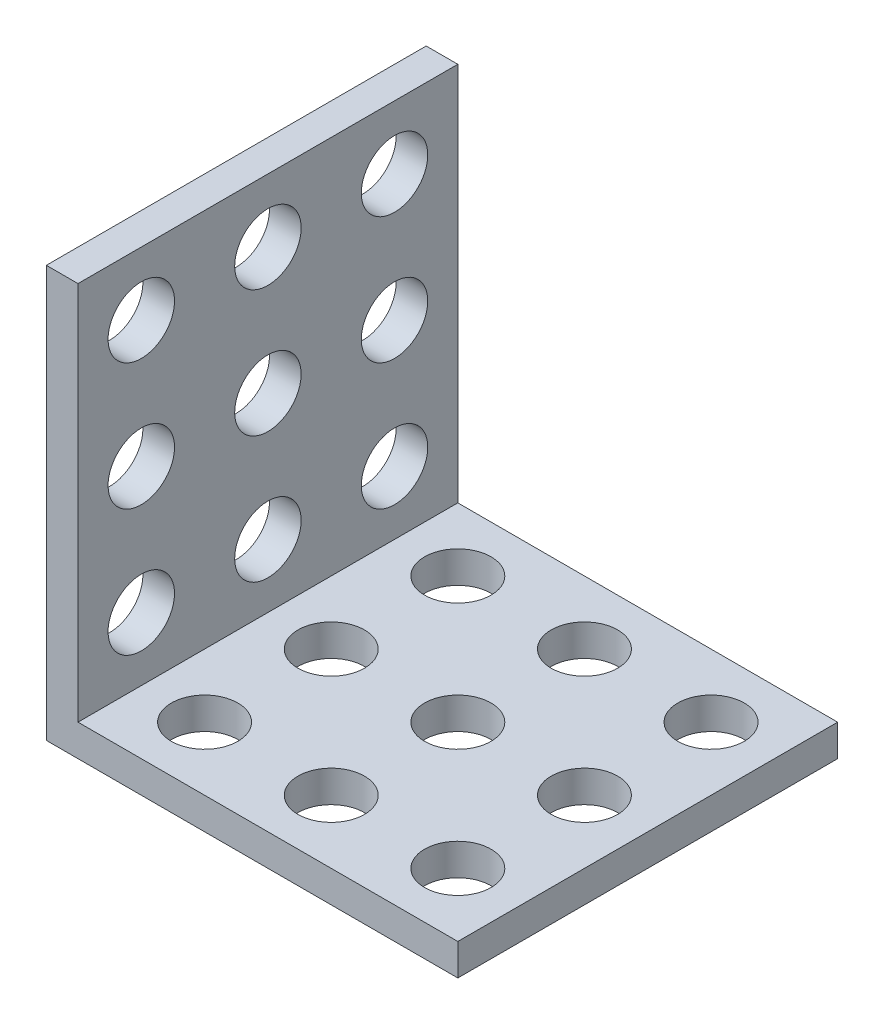
ISO-10303-21;
HEADER;
FILE_DESCRIPTION(('STEP AP214'),'2;1');
FILE_NAME('part.step','',(''),(''),'','','');
FILE_SCHEMA(('AUTOMOTIVE_DESIGN { 1 0 10303 214 1 1 1 1 }'));
ENDSEC;
DATA;
#1=APPLICATION_CONTEXT('core data for automotive mechanical design processes');
#2=APPLICATION_PROTOCOL_DEFINITION('international standard','automotive_design',2000,#1);
#3=PRODUCT_CONTEXT('',#1,'mechanical');
#4=PRODUCT('Part','Part','',(#3));
#5=PRODUCT_RELATED_PRODUCT_CATEGORY('part','',(#4));
#6=PRODUCT_DEFINITION_FORMATION('','',#4);
#7=PRODUCT_DEFINITION_CONTEXT('part definition',#1,'design');
#8=PRODUCT_DEFINITION('design','',#6,#7);
#9=PRODUCT_DEFINITION_SHAPE('','',#8);
#10=(LENGTH_UNIT() NAMED_UNIT(*) SI_UNIT(.MILLI.,.METRE.));
#11=(NAMED_UNIT(*) PLANE_ANGLE_UNIT() SI_UNIT($,.RADIAN.));
#12=(NAMED_UNIT(*) SI_UNIT($,.STERADIAN.) SOLID_ANGLE_UNIT());
#13=UNCERTAINTY_MEASURE_WITH_UNIT(LENGTH_MEASURE(1.E-05),#10,'distance_accuracy_value','');
#14=(GEOMETRIC_REPRESENTATION_CONTEXT(3) GLOBAL_UNCERTAINTY_ASSIGNED_CONTEXT((#13)) GLOBAL_UNIT_ASSIGNED_CONTEXT((#10,
#11,#12)) REPRESENTATION_CONTEXT('',''));
#15=CARTESIAN_POINT('',(0.,0.,0.));
#16=DIRECTION('',(0.,0.,1.));
#17=DIRECTION('',(1.,0.,0.));
#18=AXIS2_PLACEMENT_3D('',#15,#16,#17);
#19=CARTESIAN_POINT('',(0.,-2.,24.));
#20=DIRECTION('',(0.,1.,0.));
#21=DIRECTION('',(0.,0.,1.));
#22=AXIS2_PLACEMENT_3D('',#19,#20,#21);
#23=PLANE('',#22);
#24=CARTESIAN_POINT('',(12.,-2.,20.));
#25=DIRECTION('',(0.,1.,0.));
#26=DIRECTION('',(0.,0.,1.));
#27=AXIS2_PLACEMENT_3D('',#24,#25,#26);
#28=CIRCLE('',#27,2.1);
#29=CARTESIAN_POINT('',(12.,-2.,22.1));
#30=VERTEX_POINT('',#29);
#31=EDGE_CURVE('E349',#30,#30,#28,.T.);
#32=ORIENTED_EDGE('',*,*,#31,.T.);
#33=EDGE_LOOP('',(#32));
#34=FACE_BOUND('',#33,.T.);
#35=CARTESIAN_POINT('',(4.,-2.,20.));
#36=DIRECTION('',(0.,1.,0.));
#37=DIRECTION('',(0.,0.,1.));
#38=AXIS2_PLACEMENT_3D('',#35,#36,#37);
#39=CIRCLE('',#38,2.1);
#40=CARTESIAN_POINT('',(4.,-2.,22.1));
#41=VERTEX_POINT('',#40);
#42=EDGE_CURVE('E120',#41,#41,#39,.T.);
#43=ORIENTED_EDGE('',*,*,#42,.T.);
#44=EDGE_LOOP('',(#43));
#45=FACE_BOUND('',#44,.T.);
#46=DIRECTION('',(1.,0.,0.));
#47=VECTOR('',#46,1.);
#48=CARTESIAN_POINT('',(0.,-2.,0.));
#49=LINE('',#48,#47);
#50=CARTESIAN_POINT('',(-2.,-2.,0.));
#51=VERTEX_POINT('',#50);
#52=CARTESIAN_POINT('',(24.,-2.,0.));
#53=VERTEX_POINT('',#52);
#54=EDGE_CURVE('E116',#51,#53,#49,.T.);
#55=ORIENTED_EDGE('',*,*,#54,.T.);
#56=DIRECTION('',(0.,0.,-1.));
#57=VECTOR('',#56,1.);
#58=CARTESIAN_POINT('',(24.,-2.,24.));
#59=LINE('',#58,#57);
#60=CARTESIAN_POINT('',(24.,-2.,24.));
#61=VERTEX_POINT('',#60);
#62=EDGE_CURVE('E135',#61,#53,#59,.T.);
#63=ORIENTED_EDGE('',*,*,#62,.F.);
#64=DIRECTION('',(1.,0.,0.));
#65=VECTOR('',#64,1.);
#66=CARTESIAN_POINT('',(0.,-2.,24.));
#67=LINE('',#66,#65);
#68=CARTESIAN_POINT('',(-2.,-2.,24.));
#69=VERTEX_POINT('',#68);
#70=EDGE_CURVE('E80',#69,#61,#67,.T.);
#71=ORIENTED_EDGE('',*,*,#70,.F.);
#72=DIRECTION('',(0.,0.,-1.));
#73=VECTOR('',#72,1.);
#74=CARTESIAN_POINT('',(-2.,-2.,24.));
#75=LINE('',#74,#73);
#76=EDGE_CURVE('E112',#69,#51,#75,.T.);
#77=ORIENTED_EDGE('',*,*,#76,.T.);
#78=EDGE_LOOP('',(#55,#63,#71,#77));
#79=FACE_BOUND('',#78,.T.);
#80=CARTESIAN_POINT('',(20.,-2.,20.));
#81=DIRECTION('',(0.,1.,0.));
#82=DIRECTION('',(0.,0.,1.));
#83=AXIS2_PLACEMENT_3D('',#80,#81,#82);
#84=CIRCLE('',#83,2.1);
#85=CARTESIAN_POINT('',(20.,-2.,22.1));
#86=VERTEX_POINT('',#85);
#87=EDGE_CURVE('E137',#86,#86,#84,.T.);
#88=ORIENTED_EDGE('',*,*,#87,.T.);
#89=EDGE_LOOP('',(#88));
#90=FACE_BOUND('',#89,.T.);
#91=CARTESIAN_POINT('',(4.,-2.,12.));
#92=DIRECTION('',(0.,1.,0.));
#93=DIRECTION('',(0.,0.,1.));
#94=AXIS2_PLACEMENT_3D('',#91,#92,#93);
#95=CIRCLE('',#94,2.1);
#96=CARTESIAN_POINT('',(4.,-2.,14.1));
#97=VERTEX_POINT('',#96);
#98=EDGE_CURVE('E143',#97,#97,#95,.T.);
#99=ORIENTED_EDGE('',*,*,#98,.T.);
#100=EDGE_LOOP('',(#99));
#101=FACE_BOUND('',#100,.T.);
#102=CARTESIAN_POINT('',(12.,-2.,12.));
#103=DIRECTION('',(0.,1.,0.));
#104=DIRECTION('',(0.,0.,1.));
#105=AXIS2_PLACEMENT_3D('',#102,#103,#104);
#106=CIRCLE('',#105,2.1);
#107=CARTESIAN_POINT('',(12.,-2.,14.1));
#108=VERTEX_POINT('',#107);
#109=EDGE_CURVE('E149',#108,#108,#106,.T.);
#110=ORIENTED_EDGE('',*,*,#109,.T.);
#111=EDGE_LOOP('',(#110));
#112=FACE_BOUND('',#111,.T.);
#113=CARTESIAN_POINT('',(20.,-2.,12.));
#114=DIRECTION('',(0.,1.,0.));
#115=DIRECTION('',(0.,0.,1.));
#116=AXIS2_PLACEMENT_3D('',#113,#114,#115);
#117=CIRCLE('',#116,2.1);
#118=CARTESIAN_POINT('',(20.,-2.,14.1));
#119=VERTEX_POINT('',#118);
#120=EDGE_CURVE('E155',#119,#119,#117,.T.);
#121=ORIENTED_EDGE('',*,*,#120,.T.);
#122=EDGE_LOOP('',(#121));
#123=FACE_BOUND('',#122,.T.);
#124=CARTESIAN_POINT('',(4.,-2.,4.));
#125=DIRECTION('',(0.,1.,0.));
#126=DIRECTION('',(0.,0.,1.));
#127=AXIS2_PLACEMENT_3D('',#124,#125,#126);
#128=CIRCLE('',#127,2.1);
#129=CARTESIAN_POINT('',(4.,-2.,6.1));
#130=VERTEX_POINT('',#129);
#131=EDGE_CURVE('E161',#130,#130,#128,.T.);
#132=ORIENTED_EDGE('',*,*,#131,.T.);
#133=EDGE_LOOP('',(#132));
#134=FACE_BOUND('',#133,.T.);
#135=CARTESIAN_POINT('',(12.,-2.,4.));
#136=DIRECTION('',(0.,1.,0.));
#137=DIRECTION('',(0.,0.,1.));
#138=AXIS2_PLACEMENT_3D('',#135,#136,#137);
#139=CIRCLE('',#138,2.1);
#140=CARTESIAN_POINT('',(12.,-2.,6.1));
#141=VERTEX_POINT('',#140);
#142=EDGE_CURVE('E167',#141,#141,#139,.T.);
#143=ORIENTED_EDGE('',*,*,#142,.T.);
#144=EDGE_LOOP('',(#143));
#145=FACE_BOUND('',#144,.T.);
#146=CARTESIAN_POINT('',(20.,-2.,4.));
#147=DIRECTION('',(0.,1.,0.));
#148=DIRECTION('',(0.,0.,1.));
#149=AXIS2_PLACEMENT_3D('',#146,#147,#148);
#150=CIRCLE('',#149,2.1);
#151=CARTESIAN_POINT('',(20.,-2.,6.1));
#152=VERTEX_POINT('',#151);
#153=EDGE_CURVE('E173',#152,#152,#150,.T.);
#154=ORIENTED_EDGE('',*,*,#153,.T.);
#155=EDGE_LOOP('',(#154));
#156=FACE_BOUND('',#155,.T.);
#157=ADVANCED_FACE('F32',(#34,#45,#79,#90,#101,#112,#123,#134,#145,#156),#23,.F.);
#158=CARTESIAN_POINT('',(24.,0.,24.));
#159=DIRECTION('',(1.,0.,0.));
#160=DIRECTION('',(0.,0.,-1.));
#161=AXIS2_PLACEMENT_3D('',#158,#159,#160);
#162=PLANE('',#161);
#163=DIRECTION('',(0.,-1.,0.));
#164=VECTOR('',#163,1.);
#165=CARTESIAN_POINT('',(24.,0.,0.));
#166=LINE('',#165,#164);
#167=CARTESIAN_POINT('',(24.,0.,0.));
#168=VERTEX_POINT('',#167);
#169=EDGE_CURVE('E119',#168,#53,#166,.T.);
#170=ORIENTED_EDGE('',*,*,#169,.F.);
#171=DIRECTION('',(0.,0.,-1.));
#172=VECTOR('',#171,1.);
#173=CARTESIAN_POINT('',(24.,0.,24.));
#174=LINE('',#173,#172);
#175=CARTESIAN_POINT('',(24.,0.,24.));
#176=VERTEX_POINT('',#175);
#177=EDGE_CURVE('E133',#176,#168,#174,.T.);
#178=ORIENTED_EDGE('',*,*,#177,.F.);
#179=DIRECTION('',(0.,-1.,0.));
#180=VECTOR('',#179,1.);
#181=CARTESIAN_POINT('',(24.,0.,24.));
#182=LINE('',#181,#180);
#183=EDGE_CURVE('E361',#176,#61,#182,.T.);
#184=ORIENTED_EDGE('',*,*,#183,.T.);
#185=ORIENTED_EDGE('',*,*,#62,.T.);
#186=EDGE_LOOP('',(#170,#178,#184,#185));
#187=FACE_BOUND('',#186,.T.);
#188=ADVANCED_FACE('F233',(#187),#162,.T.);
#189=CARTESIAN_POINT('',(0.,0.,24.));
#190=DIRECTION('',(0.,1.,0.));
#191=DIRECTION('',(0.,0.,1.));
#192=AXIS2_PLACEMENT_3D('',#189,#190,#191);
#193=PLANE('',#192);
#194=CARTESIAN_POINT('',(12.,0.,20.));
#195=DIRECTION('',(0.,1.,0.));
#196=DIRECTION('',(0.,0.,1.));
#197=AXIS2_PLACEMENT_3D('',#194,#195,#196);
#198=CIRCLE('',#197,2.1);
#199=CARTESIAN_POINT('',(12.,0.,22.1));
#200=VERTEX_POINT('',#199);
#201=EDGE_CURVE('E352',#200,#200,#198,.T.);
#202=ORIENTED_EDGE('',*,*,#201,.F.);
#203=EDGE_LOOP('',(#202));
#204=FACE_BOUND('',#203,.T.);
#205=CARTESIAN_POINT('',(4.,0.,20.));
#206=DIRECTION('',(0.,1.,0.));
#207=DIRECTION('',(0.,0.,1.));
#208=AXIS2_PLACEMENT_3D('',#205,#206,#207);
#209=CIRCLE('',#208,2.1);
#210=CARTESIAN_POINT('',(4.,0.,22.1));
#211=VERTEX_POINT('',#210);
#212=EDGE_CURVE('E355',#211,#211,#209,.T.);
#213=ORIENTED_EDGE('',*,*,#212,.F.);
#214=EDGE_LOOP('',(#213));
#215=FACE_BOUND('',#214,.T.);
#216=DIRECTION('',(1.,0.,0.));
#217=VECTOR('',#216,1.);
#218=CARTESIAN_POINT('',(0.,0.,0.));
#219=LINE('',#218,#217);
#220=CARTESIAN_POINT('',(0.,0.,0.));
#221=VERTEX_POINT('',#220);
#222=EDGE_CURVE('E123',#221,#168,#219,.T.);
#223=ORIENTED_EDGE('',*,*,#222,.F.);
#224=DIRECTION('',(0.,0.,-1.));
#225=VECTOR('',#224,1.);
#226=CARTESIAN_POINT('',(0.,0.,24.));
#227=LINE('',#226,#225);
#228=CARTESIAN_POINT('',(0.,0.,24.));
#229=VERTEX_POINT('',#228);
#230=EDGE_CURVE('E102',#229,#221,#227,.T.);
#231=ORIENTED_EDGE('',*,*,#230,.F.);
#232=DIRECTION('',(1.,0.,0.));
#233=VECTOR('',#232,1.);
#234=CARTESIAN_POINT('',(0.,0.,24.));
#235=LINE('',#234,#233);
#236=EDGE_CURVE('E108',#229,#176,#235,.T.);
#237=ORIENTED_EDGE('',*,*,#236,.T.);
#238=ORIENTED_EDGE('',*,*,#177,.T.);
#239=EDGE_LOOP('',(#223,#231,#237,#238));
#240=FACE_BOUND('',#239,.T.);
#241=CARTESIAN_POINT('',(20.,0.,20.));
#242=DIRECTION('',(0.,1.,0.));
#243=DIRECTION('',(0.,0.,1.));
#244=AXIS2_PLACEMENT_3D('',#241,#242,#243);
#245=CIRCLE('',#244,2.1);
#246=CARTESIAN_POINT('',(20.,0.,22.1));
#247=VERTEX_POINT('',#246);
#248=EDGE_CURVE('E140',#247,#247,#245,.T.);
#249=ORIENTED_EDGE('',*,*,#248,.F.);
#250=EDGE_LOOP('',(#249));
#251=FACE_BOUND('',#250,.T.);
#252=CARTESIAN_POINT('',(4.,0.,12.));
#253=DIRECTION('',(0.,1.,0.));
#254=DIRECTION('',(0.,0.,1.));
#255=AXIS2_PLACEMENT_3D('',#252,#253,#254);
#256=CIRCLE('',#255,2.1);
#257=CARTESIAN_POINT('',(4.,0.,14.1));
#258=VERTEX_POINT('',#257);
#259=EDGE_CURVE('E146',#258,#258,#256,.T.);
#260=ORIENTED_EDGE('',*,*,#259,.F.);
#261=EDGE_LOOP('',(#260));
#262=FACE_BOUND('',#261,.T.);
#263=CARTESIAN_POINT('',(12.,0.,12.));
#264=DIRECTION('',(0.,1.,0.));
#265=DIRECTION('',(0.,0.,1.));
#266=AXIS2_PLACEMENT_3D('',#263,#264,#265);
#267=CIRCLE('',#266,2.1);
#268=CARTESIAN_POINT('',(12.,0.,14.1));
#269=VERTEX_POINT('',#268);
#270=EDGE_CURVE('E152',#269,#269,#267,.T.);
#271=ORIENTED_EDGE('',*,*,#270,.F.);
#272=EDGE_LOOP('',(#271));
#273=FACE_BOUND('',#272,.T.);
#274=CARTESIAN_POINT('',(20.,0.,12.));
#275=DIRECTION('',(0.,1.,0.));
#276=DIRECTION('',(0.,0.,1.));
#277=AXIS2_PLACEMENT_3D('',#274,#275,#276);
#278=CIRCLE('',#277,2.1);
#279=CARTESIAN_POINT('',(20.,0.,14.1));
#280=VERTEX_POINT('',#279);
#281=EDGE_CURVE('E158',#280,#280,#278,.T.);
#282=ORIENTED_EDGE('',*,*,#281,.F.);
#283=EDGE_LOOP('',(#282));
#284=FACE_BOUND('',#283,.T.);
#285=CARTESIAN_POINT('',(4.,0.,4.));
#286=DIRECTION('',(0.,1.,0.));
#287=DIRECTION('',(0.,0.,1.));
#288=AXIS2_PLACEMENT_3D('',#285,#286,#287);
#289=CIRCLE('',#288,2.1);
#290=CARTESIAN_POINT('',(4.,0.,6.1));
#291=VERTEX_POINT('',#290);
#292=EDGE_CURVE('E164',#291,#291,#289,.T.);
#293=ORIENTED_EDGE('',*,*,#292,.F.);
#294=EDGE_LOOP('',(#293));
#295=FACE_BOUND('',#294,.T.);
#296=CARTESIAN_POINT('',(12.,0.,4.));
#297=DIRECTION('',(0.,1.,0.));
#298=DIRECTION('',(0.,0.,1.));
#299=AXIS2_PLACEMENT_3D('',#296,#297,#298);
#300=CIRCLE('',#299,2.1);
#301=CARTESIAN_POINT('',(12.,0.,6.1));
#302=VERTEX_POINT('',#301);
#303=EDGE_CURVE('E170',#302,#302,#300,.T.);
#304=ORIENTED_EDGE('',*,*,#303,.F.);
#305=EDGE_LOOP('',(#304));
#306=FACE_BOUND('',#305,.T.);
#307=CARTESIAN_POINT('',(20.,0.,4.));
#308=DIRECTION('',(0.,1.,0.));
#309=DIRECTION('',(0.,0.,1.));
#310=AXIS2_PLACEMENT_3D('',#307,#308,#309);
#311=CIRCLE('',#310,2.1);
#312=CARTESIAN_POINT('',(20.,0.,6.1));
#313=VERTEX_POINT('',#312);
#314=EDGE_CURVE('E176',#313,#313,#311,.T.);
#315=ORIENTED_EDGE('',*,*,#314,.F.);
#316=EDGE_LOOP('',(#315));
#317=FACE_BOUND('',#316,.T.);
#318=ADVANCED_FACE('F225',(#204,#215,#240,#251,#262,#273,#284,#295,#306,#317),#193,.T.);
#319=CARTESIAN_POINT('',(0.,24.,24.));
#320=DIRECTION('',(1.,0.,0.));
#321=DIRECTION('',(0.,1.,0.));
#322=AXIS2_PLACEMENT_3D('',#319,#320,#321);
#323=PLANE('',#322);
#324=CARTESIAN_POINT('',(0.,12.,20.));
#325=DIRECTION('',(1.,0.,0.));
#326=DIRECTION('',(0.,1.,0.));
#327=AXIS2_PLACEMENT_3D('',#324,#325,#326);
#328=CIRCLE('',#327,2.1);
#329=CARTESIAN_POINT('',(0.,14.1,20.));
#330=VERTEX_POINT('',#329);
#331=EDGE_CURVE('E340',#330,#330,#328,.T.);
#332=ORIENTED_EDGE('',*,*,#331,.F.);
#333=EDGE_LOOP('',(#332));
#334=FACE_BOUND('',#333,.T.);
#335=CARTESIAN_POINT('',(0.,4.,20.));
#336=DIRECTION('',(1.,0.,0.));
#337=DIRECTION('',(0.,1.,0.));
#338=AXIS2_PLACEMENT_3D('',#335,#336,#337);
#339=CIRCLE('',#338,2.1);
#340=CARTESIAN_POINT('',(0.,6.1,20.));
#341=VERTEX_POINT('',#340);
#342=EDGE_CURVE('E341',#341,#341,#339,.T.);
#343=ORIENTED_EDGE('',*,*,#342,.F.);
#344=EDGE_LOOP('',(#343));
#345=FACE_BOUND('',#344,.T.);
#346=DIRECTION('',(0.,-1.,0.));
#347=VECTOR('',#346,1.);
#348=CARTESIAN_POINT('',(0.,24.,0.));
#349=LINE('',#348,#347);
#350=CARTESIAN_POINT('',(0.,24.,0.));
#351=VERTEX_POINT('',#350);
#352=EDGE_CURVE('E97',#351,#221,#349,.T.);
#353=ORIENTED_EDGE('',*,*,#352,.F.);
#354=DIRECTION('',(0.,0.,-1.));
#355=VECTOR('',#354,1.);
#356=CARTESIAN_POINT('',(0.,24.,24.));
#357=LINE('',#356,#355);
#358=CARTESIAN_POINT('',(0.,24.,24.));
#359=VERTEX_POINT('',#358);
#360=EDGE_CURVE('E91',#359,#351,#357,.T.);
#361=ORIENTED_EDGE('',*,*,#360,.F.);
#362=DIRECTION('',(0.,-1.,0.));
#363=VECTOR('',#362,1.);
#364=CARTESIAN_POINT('',(0.,24.,24.));
#365=LINE('',#364,#363);
#366=EDGE_CURVE('E95',#359,#229,#365,.T.);
#367=ORIENTED_EDGE('',*,*,#366,.T.);
#368=ORIENTED_EDGE('',*,*,#230,.T.);
#369=EDGE_LOOP('',(#353,#361,#367,#368));
#370=FACE_BOUND('',#369,.T.);
#371=CARTESIAN_POINT('',(0.,20.,20.));
#372=DIRECTION('',(1.,0.,0.));
#373=DIRECTION('',(0.,1.,0.));
#374=AXIS2_PLACEMENT_3D('',#371,#372,#373);
#375=CIRCLE('',#374,2.1);
#376=CARTESIAN_POINT('',(0.,22.1,20.));
#377=VERTEX_POINT('',#376);
#378=EDGE_CURVE('E182',#377,#377,#375,.T.);
#379=ORIENTED_EDGE('',*,*,#378,.F.);
#380=EDGE_LOOP('',(#379));
#381=FACE_BOUND('',#380,.T.);
#382=CARTESIAN_POINT('',(0.,4.,12.));
#383=DIRECTION('',(1.,0.,0.));
#384=DIRECTION('',(0.,1.,0.));
#385=AXIS2_PLACEMENT_3D('',#382,#383,#384);
#386=CIRCLE('',#385,2.1);
#387=CARTESIAN_POINT('',(0.,6.1,12.));
#388=VERTEX_POINT('',#387);
#389=EDGE_CURVE('E188',#388,#388,#386,.T.);
#390=ORIENTED_EDGE('',*,*,#389,.F.);
#391=EDGE_LOOP('',(#390));
#392=FACE_BOUND('',#391,.T.);
#393=CARTESIAN_POINT('',(0.,12.,12.));
#394=DIRECTION('',(1.,0.,0.));
#395=DIRECTION('',(0.,1.,0.));
#396=AXIS2_PLACEMENT_3D('',#393,#394,#395);
#397=CIRCLE('',#396,2.1);
#398=CARTESIAN_POINT('',(0.,14.1,12.));
#399=VERTEX_POINT('',#398);
#400=EDGE_CURVE('E194',#399,#399,#397,.T.);
#401=ORIENTED_EDGE('',*,*,#400,.F.);
#402=EDGE_LOOP('',(#401));
#403=FACE_BOUND('',#402,.T.);
#404=CARTESIAN_POINT('',(0.,20.,12.));
#405=DIRECTION('',(1.,0.,0.));
#406=DIRECTION('',(0.,1.,0.));
#407=AXIS2_PLACEMENT_3D('',#404,#405,#406);
#408=CIRCLE('',#407,2.1);
#409=CARTESIAN_POINT('',(0.,22.1,12.));
#410=VERTEX_POINT('',#409);
#411=EDGE_CURVE('E200',#410,#410,#408,.T.);
#412=ORIENTED_EDGE('',*,*,#411,.F.);
#413=EDGE_LOOP('',(#412));
#414=FACE_BOUND('',#413,.T.);
#415=CARTESIAN_POINT('',(0.,4.,4.));
#416=DIRECTION('',(1.,0.,0.));
#417=DIRECTION('',(0.,1.,0.));
#418=AXIS2_PLACEMENT_3D('',#415,#416,#417);
#419=CIRCLE('',#418,2.1);
#420=CARTESIAN_POINT('',(0.,6.1,4.));
#421=VERTEX_POINT('',#420);
#422=EDGE_CURVE('E206',#421,#421,#419,.T.);
#423=ORIENTED_EDGE('',*,*,#422,.F.);
#424=EDGE_LOOP('',(#423));
#425=FACE_BOUND('',#424,.T.);
#426=CARTESIAN_POINT('',(0.,12.,4.));
#427=DIRECTION('',(1.,0.,0.));
#428=DIRECTION('',(0.,1.,0.));
#429=AXIS2_PLACEMENT_3D('',#426,#427,#428);
#430=CIRCLE('',#429,2.1);
#431=CARTESIAN_POINT('',(0.,14.1,4.));
#432=VERTEX_POINT('',#431);
#433=EDGE_CURVE('E212',#432,#432,#430,.T.);
#434=ORIENTED_EDGE('',*,*,#433,.F.);
#435=EDGE_LOOP('',(#434));
#436=FACE_BOUND('',#435,.T.);
#437=CARTESIAN_POINT('',(0.,20.,4.));
#438=DIRECTION('',(1.,0.,0.));
#439=DIRECTION('',(0.,1.,0.));
#440=AXIS2_PLACEMENT_3D('',#437,#438,#439);
#441=CIRCLE('',#440,2.1);
#442=CARTESIAN_POINT('',(0.,22.1,4.));
#443=VERTEX_POINT('',#442);
#444=EDGE_CURVE('E11',#443,#443,#441,.T.);
#445=ORIENTED_EDGE('',*,*,#444,.F.);
#446=EDGE_LOOP('',(#445));
#447=FACE_BOUND('',#446,.T.);
#448=ADVANCED_FACE('F93',(#334,#345,#370,#381,#392,#403,#414,#425,#436,#447),#323,.T.);
#449=CARTESIAN_POINT('',(-2.,24.,24.));
#450=DIRECTION('',(0.,1.,0.));
#451=DIRECTION('',(0.,0.,1.));
#452=AXIS2_PLACEMENT_3D('',#449,#450,#451);
#453=PLANE('',#452);
#454=DIRECTION('',(1.,0.,0.));
#455=VECTOR('',#454,1.);
#456=CARTESIAN_POINT('',(-2.,24.,0.));
#457=LINE('',#456,#455);
#458=CARTESIAN_POINT('',(-2.,24.,0.));
#459=VERTEX_POINT('',#458);
#460=EDGE_CURVE('E127',#459,#351,#457,.T.);
#461=ORIENTED_EDGE('',*,*,#460,.F.);
#462=DIRECTION('',(0.,0.,-1.));
#463=VECTOR('',#462,1.);
#464=CARTESIAN_POINT('',(-2.,24.,24.));
#465=LINE('',#464,#463);
#466=CARTESIAN_POINT('',(-2.,24.,24.));
#467=VERTEX_POINT('',#466);
#468=EDGE_CURVE('E71',#467,#459,#465,.T.);
#469=ORIENTED_EDGE('',*,*,#468,.F.);
#470=DIRECTION('',(1.,0.,0.));
#471=VECTOR('',#470,1.);
#472=CARTESIAN_POINT('',(-2.,24.,24.));
#473=LINE('',#472,#471);
#474=EDGE_CURVE('E106',#467,#359,#473,.T.);
#475=ORIENTED_EDGE('',*,*,#474,.T.);
#476=ORIENTED_EDGE('',*,*,#360,.T.);
#477=EDGE_LOOP('',(#461,#469,#475,#476));
#478=FACE_BOUND('',#477,.T.);
#479=ADVANCED_FACE('F110',(#478),#453,.T.);
#480=CARTESIAN_POINT('',(-2.,24.,24.));
#481=DIRECTION('',(1.,0.,0.));
#482=DIRECTION('',(0.,1.,0.));
#483=AXIS2_PLACEMENT_3D('',#480,#481,#482);
#484=PLANE('',#483);
#485=CARTESIAN_POINT('',(-2.,12.,20.));
#486=DIRECTION('',(1.,0.,0.));
#487=DIRECTION('',(0.,1.,0.));
#488=AXIS2_PLACEMENT_3D('',#485,#486,#487);
#489=CIRCLE('',#488,2.1);
#490=CARTESIAN_POINT('',(-2.,14.1,20.));
#491=VERTEX_POINT('',#490);
#492=EDGE_CURVE('E338',#491,#491,#489,.T.);
#493=ORIENTED_EDGE('',*,*,#492,.T.);
#494=EDGE_LOOP('',(#493));
#495=FACE_BOUND('',#494,.T.);
#496=CARTESIAN_POINT('',(-2.,4.,20.));
#497=DIRECTION('',(1.,0.,0.));
#498=DIRECTION('',(0.,1.,0.));
#499=AXIS2_PLACEMENT_3D('',#496,#497,#498);
#500=CIRCLE('',#499,2.1);
#501=CARTESIAN_POINT('',(-2.,6.1,20.));
#502=VERTEX_POINT('',#501);
#503=EDGE_CURVE('E344',#502,#502,#500,.T.);
#504=ORIENTED_EDGE('',*,*,#503,.T.);
#505=EDGE_LOOP('',(#504));
#506=FACE_BOUND('',#505,.T.);
#507=DIRECTION('',(0.,-1.,0.));
#508=VECTOR('',#507,1.);
#509=CARTESIAN_POINT('',(-2.,24.,0.));
#510=LINE('',#509,#508);
#511=EDGE_CURVE('E74',#459,#51,#510,.T.);
#512=ORIENTED_EDGE('',*,*,#511,.T.);
#513=ORIENTED_EDGE('',*,*,#76,.F.);
#514=DIRECTION('',(0.,-1.,0.));
#515=VECTOR('',#514,1.);
#516=CARTESIAN_POINT('',(-2.,24.,24.));
#517=LINE('',#516,#515);
#518=EDGE_CURVE('E49',#467,#69,#517,.T.);
#519=ORIENTED_EDGE('',*,*,#518,.F.);
#520=ORIENTED_EDGE('',*,*,#468,.T.);
#521=EDGE_LOOP('',(#512,#513,#519,#520));
#522=FACE_BOUND('',#521,.T.);
#523=CARTESIAN_POINT('',(-2.,20.,20.));
#524=DIRECTION('',(1.,0.,0.));
#525=DIRECTION('',(0.,1.,0.));
#526=AXIS2_PLACEMENT_3D('',#523,#524,#525);
#527=CIRCLE('',#526,2.1);
#528=CARTESIAN_POINT('',(-2.,22.1,20.));
#529=VERTEX_POINT('',#528);
#530=EDGE_CURVE('E179',#529,#529,#527,.T.);
#531=ORIENTED_EDGE('',*,*,#530,.T.);
#532=EDGE_LOOP('',(#531));
#533=FACE_BOUND('',#532,.T.);
#534=CARTESIAN_POINT('',(-2.,4.,12.));
#535=DIRECTION('',(1.,0.,0.));
#536=DIRECTION('',(0.,1.,0.));
#537=AXIS2_PLACEMENT_3D('',#534,#535,#536);
#538=CIRCLE('',#537,2.1);
#539=CARTESIAN_POINT('',(-2.,6.1,12.));
#540=VERTEX_POINT('',#539);
#541=EDGE_CURVE('E185',#540,#540,#538,.T.);
#542=ORIENTED_EDGE('',*,*,#541,.T.);
#543=EDGE_LOOP('',(#542));
#544=FACE_BOUND('',#543,.T.);
#545=CARTESIAN_POINT('',(-2.,12.,12.));
#546=DIRECTION('',(1.,0.,0.));
#547=DIRECTION('',(0.,1.,0.));
#548=AXIS2_PLACEMENT_3D('',#545,#546,#547);
#549=CIRCLE('',#548,2.1);
#550=CARTESIAN_POINT('',(-2.,14.1,12.));
#551=VERTEX_POINT('',#550);
#552=EDGE_CURVE('E191',#551,#551,#549,.T.);
#553=ORIENTED_EDGE('',*,*,#552,.T.);
#554=EDGE_LOOP('',(#553));
#555=FACE_BOUND('',#554,.T.);
#556=CARTESIAN_POINT('',(-2.,20.,12.));
#557=DIRECTION('',(1.,0.,0.));
#558=DIRECTION('',(0.,1.,0.));
#559=AXIS2_PLACEMENT_3D('',#556,#557,#558);
#560=CIRCLE('',#559,2.1);
#561=CARTESIAN_POINT('',(-2.,22.1,12.));
#562=VERTEX_POINT('',#561);
#563=EDGE_CURVE('E197',#562,#562,#560,.T.);
#564=ORIENTED_EDGE('',*,*,#563,.T.);
#565=EDGE_LOOP('',(#564));
#566=FACE_BOUND('',#565,.T.);
#567=CARTESIAN_POINT('',(-2.,4.,4.));
#568=DIRECTION('',(1.,0.,0.));
#569=DIRECTION('',(0.,1.,0.));
#570=AXIS2_PLACEMENT_3D('',#567,#568,#569);
#571=CIRCLE('',#570,2.1);
#572=CARTESIAN_POINT('',(-2.,6.1,4.));
#573=VERTEX_POINT('',#572);
#574=EDGE_CURVE('E203',#573,#573,#571,.T.);
#575=ORIENTED_EDGE('',*,*,#574,.T.);
#576=EDGE_LOOP('',(#575));
#577=FACE_BOUND('',#576,.T.);
#578=CARTESIAN_POINT('',(-2.,12.,4.));
#579=DIRECTION('',(1.,0.,0.));
#580=DIRECTION('',(0.,1.,0.));
#581=AXIS2_PLACEMENT_3D('',#578,#579,#580);
#582=CIRCLE('',#581,2.1);
#583=CARTESIAN_POINT('',(-2.,14.1,4.));
#584=VERTEX_POINT('',#583);
#585=EDGE_CURVE('E209',#584,#584,#582,.T.);
#586=ORIENTED_EDGE('',*,*,#585,.T.);
#587=EDGE_LOOP('',(#586));
#588=FACE_BOUND('',#587,.T.);
#589=CARTESIAN_POINT('',(-2.,20.,4.));
#590=DIRECTION('',(1.,0.,0.));
#591=DIRECTION('',(0.,1.,0.));
#592=AXIS2_PLACEMENT_3D('',#589,#590,#591);
#593=CIRCLE('',#592,2.1);
#594=CARTESIAN_POINT('',(-2.,22.1,4.));
#595=VERTEX_POINT('',#594);
#596=EDGE_CURVE('E41',#595,#595,#593,.T.);
#597=ORIENTED_EDGE('',*,*,#596,.T.);
#598=EDGE_LOOP('',(#597));
#599=FACE_BOUND('',#598,.T.);
#600=ADVANCED_FACE('F217',(#495,#506,#522,#533,#544,#555,#566,#577,#588,#599),#484,.F.);
#601=CARTESIAN_POINT('',(0.,0.,24.));
#602=DIRECTION('',(0.,0.,-1.));
#603=DIRECTION('',(-1.,0.,0.));
#604=AXIS2_PLACEMENT_3D('',#601,#602,#603);
#605=PLANE('',#604);
#606=ORIENTED_EDGE('',*,*,#70,.T.);
#607=ORIENTED_EDGE('',*,*,#183,.F.);
#608=ORIENTED_EDGE('',*,*,#236,.F.);
#609=ORIENTED_EDGE('',*,*,#366,.F.);
#610=ORIENTED_EDGE('',*,*,#474,.F.);
#611=ORIENTED_EDGE('',*,*,#518,.T.);
#612=EDGE_LOOP('',(#606,#607,#608,#609,#610,#611));
#613=FACE_BOUND('',#612,.T.);
#614=ADVANCED_FACE('F105',(#613),#605,.F.);
#615=CARTESIAN_POINT('',(0.,0.,0.));
#616=DIRECTION('',(0.,0.,-1.));
#617=DIRECTION('',(-1.,0.,0.));
#618=AXIS2_PLACEMENT_3D('',#615,#616,#617);
#619=PLANE('',#618);
#620=ORIENTED_EDGE('',*,*,#54,.F.);
#621=ORIENTED_EDGE('',*,*,#511,.F.);
#622=ORIENTED_EDGE('',*,*,#460,.T.);
#623=ORIENTED_EDGE('',*,*,#352,.T.);
#624=ORIENTED_EDGE('',*,*,#222,.T.);
#625=ORIENTED_EDGE('',*,*,#169,.T.);
#626=EDGE_LOOP('',(#620,#621,#622,#623,#624,#625));
#627=FACE_BOUND('',#626,.T.);
#628=ADVANCED_FACE('F314',(#627),#619,.T.);
#629=CARTESIAN_POINT('',(4.,-2.,20.));
#630=DIRECTION('',(0.,1.,0.));
#631=DIRECTION('',(0.,0.,1.));
#632=AXIS2_PLACEMENT_3D('',#629,#630,#631);
#633=CYLINDRICAL_SURFACE('',#632,2.1);
#634=ORIENTED_EDGE('',*,*,#42,.F.);
#635=EDGE_LOOP('',(#634));
#636=FACE_BOUND('',#635,.T.);
#637=ORIENTED_EDGE('',*,*,#212,.T.);
#638=EDGE_LOOP('',(#637));
#639=FACE_BOUND('',#638,.T.);
#640=ADVANCED_FACE('F320',(#636,#639),#633,.F.);
#641=CARTESIAN_POINT('',(12.,-2.,20.));
#642=DIRECTION('',(0.,1.,0.));
#643=DIRECTION('',(0.,0.,1.));
#644=AXIS2_PLACEMENT_3D('',#641,#642,#643);
#645=CYLINDRICAL_SURFACE('',#644,2.1);
#646=ORIENTED_EDGE('',*,*,#31,.F.);
#647=EDGE_LOOP('',(#646));
#648=FACE_BOUND('',#647,.T.);
#649=ORIENTED_EDGE('',*,*,#201,.T.);
#650=EDGE_LOOP('',(#649));
#651=FACE_BOUND('',#650,.T.);
#652=ADVANCED_FACE('F253',(#648,#651),#645,.F.);
#653=CARTESIAN_POINT('',(20.,-2.,20.));
#654=DIRECTION('',(0.,1.,0.));
#655=DIRECTION('',(0.,0.,1.));
#656=AXIS2_PLACEMENT_3D('',#653,#654,#655);
#657=CYLINDRICAL_SURFACE('',#656,2.1);
#658=ORIENTED_EDGE('',*,*,#87,.F.);
#659=EDGE_LOOP('',(#658));
#660=FACE_BOUND('',#659,.T.);
#661=ORIENTED_EDGE('',*,*,#248,.T.);
#662=EDGE_LOOP('',(#661));
#663=FACE_BOUND('',#662,.T.);
#664=ADVANCED_FACE('F249',(#660,#663),#657,.F.);
#665=CARTESIAN_POINT('',(4.,-2.,12.));
#666=DIRECTION('',(0.,1.,0.));
#667=DIRECTION('',(0.,0.,1.));
#668=AXIS2_PLACEMENT_3D('',#665,#666,#667);
#669=CYLINDRICAL_SURFACE('',#668,2.1);
#670=ORIENTED_EDGE('',*,*,#98,.F.);
#671=EDGE_LOOP('',(#670));
#672=FACE_BOUND('',#671,.T.);
#673=ORIENTED_EDGE('',*,*,#259,.T.);
#674=EDGE_LOOP('',(#673));
#675=FACE_BOUND('',#674,.T.);
#676=ADVANCED_FACE('F252',(#672,#675),#669,.F.);
#677=CARTESIAN_POINT('',(12.,-2.,12.));
#678=DIRECTION('',(0.,1.,0.));
#679=DIRECTION('',(0.,0.,1.));
#680=AXIS2_PLACEMENT_3D('',#677,#678,#679);
#681=CYLINDRICAL_SURFACE('',#680,2.1);
#682=ORIENTED_EDGE('',*,*,#109,.F.);
#683=EDGE_LOOP('',(#682));
#684=FACE_BOUND('',#683,.T.);
#685=ORIENTED_EDGE('',*,*,#270,.T.);
#686=EDGE_LOOP('',(#685));
#687=FACE_BOUND('',#686,.T.);
#688=ADVANCED_FACE('F257',(#684,#687),#681,.F.);
#689=CARTESIAN_POINT('',(20.,-2.,12.));
#690=DIRECTION('',(0.,1.,0.));
#691=DIRECTION('',(0.,0.,1.));
#692=AXIS2_PLACEMENT_3D('',#689,#690,#691);
#693=CYLINDRICAL_SURFACE('',#692,2.1);
#694=ORIENTED_EDGE('',*,*,#120,.F.);
#695=EDGE_LOOP('',(#694));
#696=FACE_BOUND('',#695,.T.);
#697=ORIENTED_EDGE('',*,*,#281,.T.);
#698=EDGE_LOOP('',(#697));
#699=FACE_BOUND('',#698,.T.);
#700=ADVANCED_FACE('F261',(#696,#699),#693,.F.);
#701=CARTESIAN_POINT('',(4.,-2.,4.));
#702=DIRECTION('',(0.,1.,0.));
#703=DIRECTION('',(0.,0.,1.));
#704=AXIS2_PLACEMENT_3D('',#701,#702,#703);
#705=CYLINDRICAL_SURFACE('',#704,2.1);
#706=ORIENTED_EDGE('',*,*,#131,.F.);
#707=EDGE_LOOP('',(#706));
#708=FACE_BOUND('',#707,.T.);
#709=ORIENTED_EDGE('',*,*,#292,.T.);
#710=EDGE_LOOP('',(#709));
#711=FACE_BOUND('',#710,.T.);
#712=ADVANCED_FACE('F265',(#708,#711),#705,.F.);
#713=CARTESIAN_POINT('',(12.,-2.,4.));
#714=DIRECTION('',(0.,1.,0.));
#715=DIRECTION('',(0.,0.,1.));
#716=AXIS2_PLACEMENT_3D('',#713,#714,#715);
#717=CYLINDRICAL_SURFACE('',#716,2.1);
#718=ORIENTED_EDGE('',*,*,#142,.F.);
#719=EDGE_LOOP('',(#718));
#720=FACE_BOUND('',#719,.T.);
#721=ORIENTED_EDGE('',*,*,#303,.T.);
#722=EDGE_LOOP('',(#721));
#723=FACE_BOUND('',#722,.T.);
#724=ADVANCED_FACE('F269',(#720,#723),#717,.F.);
#725=CARTESIAN_POINT('',(20.,-2.,4.));
#726=DIRECTION('',(0.,1.,0.));
#727=DIRECTION('',(0.,0.,1.));
#728=AXIS2_PLACEMENT_3D('',#725,#726,#727);
#729=CYLINDRICAL_SURFACE('',#728,2.1);
#730=ORIENTED_EDGE('',*,*,#153,.F.);
#731=EDGE_LOOP('',(#730));
#732=FACE_BOUND('',#731,.T.);
#733=ORIENTED_EDGE('',*,*,#314,.T.);
#734=EDGE_LOOP('',(#733));
#735=FACE_BOUND('',#734,.T.);
#736=ADVANCED_FACE('F273',(#732,#735),#729,.F.);
#737=CARTESIAN_POINT('',(-2.,4.,20.));
#738=DIRECTION('',(1.,0.,0.));
#739=DIRECTION('',(0.,1.,0.));
#740=AXIS2_PLACEMENT_3D('',#737,#738,#739);
#741=CYLINDRICAL_SURFACE('',#740,2.1);
#742=ORIENTED_EDGE('',*,*,#503,.F.);
#743=EDGE_LOOP('',(#742));
#744=FACE_BOUND('',#743,.T.);
#745=ORIENTED_EDGE('',*,*,#342,.T.);
#746=EDGE_LOOP('',(#745));
#747=FACE_BOUND('',#746,.T.);
#748=ADVANCED_FACE('F277',(#744,#747),#741,.F.);
#749=CARTESIAN_POINT('',(-2.,12.,20.));
#750=DIRECTION('',(1.,0.,0.));
#751=DIRECTION('',(0.,1.,0.));
#752=AXIS2_PLACEMENT_3D('',#749,#750,#751);
#753=CYLINDRICAL_SURFACE('',#752,2.1);
#754=ORIENTED_EDGE('',*,*,#492,.F.);
#755=EDGE_LOOP('',(#754));
#756=FACE_BOUND('',#755,.T.);
#757=ORIENTED_EDGE('',*,*,#331,.T.);
#758=EDGE_LOOP('',(#757));
#759=FACE_BOUND('',#758,.T.);
#760=ADVANCED_FACE('F283',(#756,#759),#753,.F.);
#761=CARTESIAN_POINT('',(-2.,20.,20.));
#762=DIRECTION('',(1.,0.,0.));
#763=DIRECTION('',(0.,1.,0.));
#764=AXIS2_PLACEMENT_3D('',#761,#762,#763);
#765=CYLINDRICAL_SURFACE('',#764,2.1);
#766=ORIENTED_EDGE('',*,*,#530,.F.);
#767=EDGE_LOOP('',(#766));
#768=FACE_BOUND('',#767,.T.);
#769=ORIENTED_EDGE('',*,*,#378,.T.);
#770=EDGE_LOOP('',(#769));
#771=FACE_BOUND('',#770,.T.);
#772=ADVANCED_FACE('F279',(#768,#771),#765,.F.);
#773=CARTESIAN_POINT('',(-2.,4.,12.));
#774=DIRECTION('',(1.,0.,0.));
#775=DIRECTION('',(0.,1.,0.));
#776=AXIS2_PLACEMENT_3D('',#773,#774,#775);
#777=CYLINDRICAL_SURFACE('',#776,2.1);
#778=ORIENTED_EDGE('',*,*,#541,.F.);
#779=EDGE_LOOP('',(#778));
#780=FACE_BOUND('',#779,.T.);
#781=ORIENTED_EDGE('',*,*,#389,.T.);
#782=EDGE_LOOP('',(#781));
#783=FACE_BOUND('',#782,.T.);
#784=ADVANCED_FACE('F282',(#780,#783),#777,.F.);
#785=CARTESIAN_POINT('',(-2.,12.,12.));
#786=DIRECTION('',(1.,0.,0.));
#787=DIRECTION('',(0.,1.,0.));
#788=AXIS2_PLACEMENT_3D('',#785,#786,#787);
#789=CYLINDRICAL_SURFACE('',#788,2.1);
#790=ORIENTED_EDGE('',*,*,#552,.F.);
#791=EDGE_LOOP('',(#790));
#792=FACE_BOUND('',#791,.T.);
#793=ORIENTED_EDGE('',*,*,#400,.T.);
#794=EDGE_LOOP('',(#793));
#795=FACE_BOUND('',#794,.T.);
#796=ADVANCED_FACE('F287',(#792,#795),#789,.F.);
#797=CARTESIAN_POINT('',(-2.,20.,12.));
#798=DIRECTION('',(1.,0.,0.));
#799=DIRECTION('',(0.,1.,0.));
#800=AXIS2_PLACEMENT_3D('',#797,#798,#799);
#801=CYLINDRICAL_SURFACE('',#800,2.1);
#802=ORIENTED_EDGE('',*,*,#563,.F.);
#803=EDGE_LOOP('',(#802));
#804=FACE_BOUND('',#803,.T.);
#805=ORIENTED_EDGE('',*,*,#411,.T.);
#806=EDGE_LOOP('',(#805));
#807=FACE_BOUND('',#806,.T.);
#808=ADVANCED_FACE('F291',(#804,#807),#801,.F.);
#809=CARTESIAN_POINT('',(-2.,4.,4.));
#810=DIRECTION('',(1.,0.,0.));
#811=DIRECTION('',(0.,1.,0.));
#812=AXIS2_PLACEMENT_3D('',#809,#810,#811);
#813=CYLINDRICAL_SURFACE('',#812,2.1);
#814=ORIENTED_EDGE('',*,*,#574,.F.);
#815=EDGE_LOOP('',(#814));
#816=FACE_BOUND('',#815,.T.);
#817=ORIENTED_EDGE('',*,*,#422,.T.);
#818=EDGE_LOOP('',(#817));
#819=FACE_BOUND('',#818,.T.);
#820=ADVANCED_FACE('F295',(#816,#819),#813,.F.);
#821=CARTESIAN_POINT('',(-2.,12.,4.));
#822=DIRECTION('',(1.,0.,0.));
#823=DIRECTION('',(0.,1.,0.));
#824=AXIS2_PLACEMENT_3D('',#821,#822,#823);
#825=CYLINDRICAL_SURFACE('',#824,2.1);
#826=ORIENTED_EDGE('',*,*,#585,.F.);
#827=EDGE_LOOP('',(#826));
#828=FACE_BOUND('',#827,.T.);
#829=ORIENTED_EDGE('',*,*,#433,.T.);
#830=EDGE_LOOP('',(#829));
#831=FACE_BOUND('',#830,.T.);
#832=ADVANCED_FACE('F221',(#828,#831),#825,.F.);
#833=CARTESIAN_POINT('',(-2.,20.,4.));
#834=DIRECTION('',(1.,0.,0.));
#835=DIRECTION('',(0.,1.,0.));
#836=AXIS2_PLACEMENT_3D('',#833,#834,#835);
#837=CYLINDRICAL_SURFACE('',#836,2.1);
#838=ORIENTED_EDGE('',*,*,#596,.F.);
#839=EDGE_LOOP('',(#838));
#840=FACE_BOUND('',#839,.T.);
#841=ORIENTED_EDGE('',*,*,#444,.T.);
#842=EDGE_LOOP('',(#841));
#843=FACE_BOUND('',#842,.T.);
#844=ADVANCED_FACE('F34',(#840,#843),#837,.F.);
#845=CLOSED_SHELL('',(#157,#188,#318,#448,#479,#600,#614,#628,#640,#652,#664,#676,#688,#700,
#712,#724,#736,#748,#760,#772,#784,#796,#808,#820,#832,#844));
#846=MANIFOLD_SOLID_BREP('B2',#845);
#847=ADVANCED_BREP_SHAPE_REPRESENTATION('',(#18,#846),#14);
#848=SHAPE_DEFINITION_REPRESENTATION(#9,#847);
ENDSEC;
END-ISO-10303-21;
